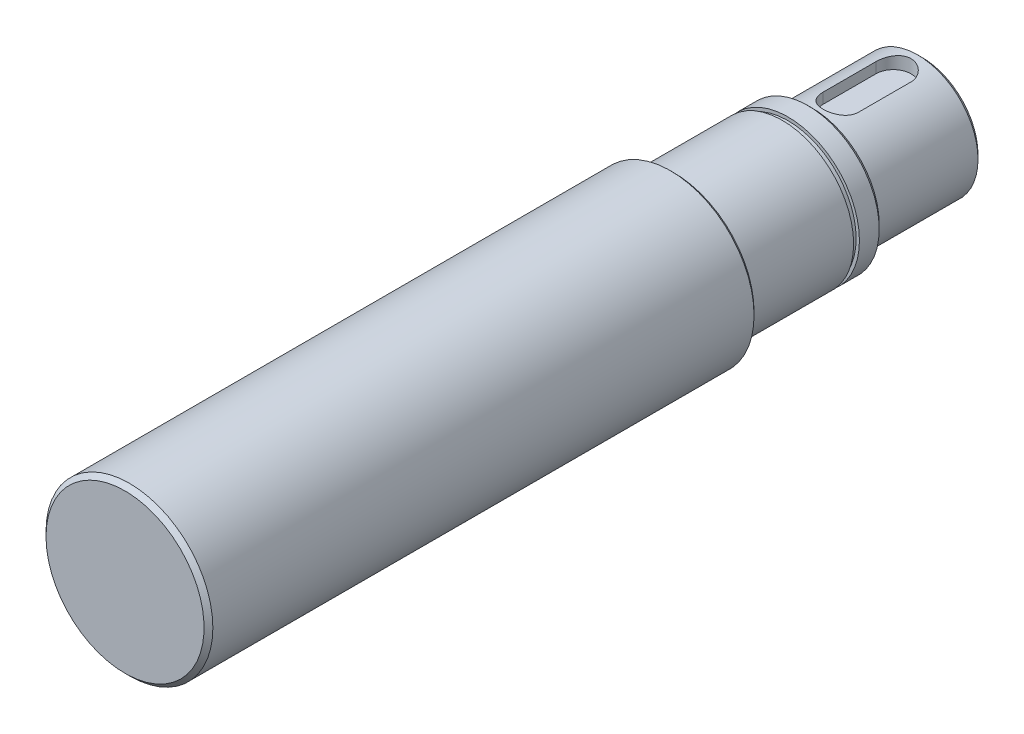
ISO-10303-21;
HEADER;
FILE_DESCRIPTION(('STEP AP214'),'2;1');
FILE_NAME('part.step','',(''),(''),'','','');
FILE_SCHEMA(('AUTOMOTIVE_DESIGN { 1 0 10303 214 1 1 1 1 }'));
ENDSEC;
DATA;
#1=APPLICATION_CONTEXT('core data for automotive mechanical design processes');
#2=APPLICATION_PROTOCOL_DEFINITION('international standard','automotive_design',2000,#1);
#3=PRODUCT_CONTEXT('',#1,'mechanical');
#4=PRODUCT('Part','Part','',(#3));
#5=PRODUCT_RELATED_PRODUCT_CATEGORY('part','',(#4));
#6=PRODUCT_DEFINITION_FORMATION('','',#4);
#7=PRODUCT_DEFINITION_CONTEXT('part definition',#1,'design');
#8=PRODUCT_DEFINITION('design','',#6,#7);
#9=PRODUCT_DEFINITION_SHAPE('','',#8);
#10=(LENGTH_UNIT() NAMED_UNIT(*) SI_UNIT(.MILLI.,.METRE.));
#11=(NAMED_UNIT(*) PLANE_ANGLE_UNIT() SI_UNIT($,.RADIAN.));
#12=(NAMED_UNIT(*) SI_UNIT($,.STERADIAN.) SOLID_ANGLE_UNIT());
#13=UNCERTAINTY_MEASURE_WITH_UNIT(LENGTH_MEASURE(1.E-05),#10,'distance_accuracy_value','');
#14=(GEOMETRIC_REPRESENTATION_CONTEXT(3) GLOBAL_UNCERTAINTY_ASSIGNED_CONTEXT((#13)) GLOBAL_UNIT_ASSIGNED_CONTEXT((#10,
#11,#12)) REPRESENTATION_CONTEXT('',''));
#15=CARTESIAN_POINT('',(0.,0.,0.));
#16=DIRECTION('',(0.,0.,1.));
#17=DIRECTION('',(1.,0.,0.));
#18=AXIS2_PLACEMENT_3D('',#15,#16,#17);
#19=CARTESIAN_POINT('',(0.,0.,0.));
#20=DIRECTION('',(0.,0.,1.));
#21=DIRECTION('',(1.,0.,0.));
#22=AXIS2_PLACEMENT_3D('',#19,#20,#21);
#23=CYLINDRICAL_SURFACE('',#22,27.5);
#24=CARTESIAN_POINT('',(0.,0.,-361.));
#25=DIRECTION('',(0.,0.,1.));
#26=DIRECTION('',(1.,0.,0.));
#27=AXIS2_PLACEMENT_3D('',#24,#25,#26);
#28=CIRCLE('',#27,27.5);
#29=CARTESIAN_POINT('',(27.5,0.,-361.));
#30=VERTEX_POINT('',#29);
#31=EDGE_CURVE('E137',#30,#30,#28,.T.);
#32=ORIENTED_EDGE('',*,*,#31,.T.);
#33=EDGE_LOOP('',(#32));
#34=FACE_BOUND('',#33,.T.);
#35=CARTESIAN_POINT('',(0.,0.,-313.));
#36=DIRECTION('',(0.,0.,1.));
#37=DIRECTION('',(1.,0.,0.));
#38=AXIS2_PLACEMENT_3D('',#35,#36,#37);
#39=CIRCLE('',#38,27.5);
#40=CARTESIAN_POINT('',(27.5,0.,-313.));
#41=VERTEX_POINT('',#40);
#42=EDGE_CURVE('E107',#41,#41,#39,.T.);
#43=ORIENTED_EDGE('',*,*,#42,.F.);
#44=EDGE_LOOP('',(#43));
#45=FACE_BOUND('',#44,.T.);
#46=CARTESIAN_POINT('',(-7.99999999999996,26.3106442338458,-326.));
#47=CARTESIAN_POINT('',(-8.0000294125095,26.3106138464806,-325.780113530022));
#48=CARTESIAN_POINT('',(-7.99093569772383,26.31339970325,-325.560238022543));
#49=CARTESIAN_POINT('',(-7.95471953682605,26.3243821575892,-325.122158396132));
#50=CARTESIAN_POINT('',(-7.92760094142261,26.3325775994905,-324.903953930281));
#51=CARTESIAN_POINT('',(-7.85563960143693,26.3541315251911,-324.471295019735));
#52=CARTESIAN_POINT('',(-7.81083993332264,26.3674774590875,-324.256832774078));
#53=CARTESIAN_POINT('',(-7.703916617101,26.3989164788629,-323.832626447351));
#54=CARTESIAN_POINT('',(-7.6417925588213,26.4170096771374,-323.622882478118));
#55=CARTESIAN_POINT('',(-7.50077525029605,26.4573947181872,-323.209657782783));
#56=CARTESIAN_POINT('',(-7.42189097222969,26.4796843137982,-323.006173772021));
#57=CARTESIAN_POINT('',(-7.24792208748815,26.5278301044113,-322.606605799624));
#58=CARTESIAN_POINT('',(-7.15283147638133,26.5536876206464,-322.410524613738));
#59=CARTESIAN_POINT('',(-6.94715180070411,26.6082392780648,-322.02703718235));
#60=CARTESIAN_POINT('',(-6.83655988627858,26.63693394056,-321.839632540443));
#61=CARTESIAN_POINT('',(-6.60065041990186,26.6963706560259,-321.47466776478));
#62=CARTESIAN_POINT('',(-6.47533210047649,26.7271128156667,-321.297108144814));
#63=CARTESIAN_POINT('',(-6.20724750295717,26.7906616850295,-320.948292516178));
#64=CARTESIAN_POINT('',(-6.06410407777572,26.8235016269389,-320.77733231253));
#65=CARTESIAN_POINT('',(-5.76409444246161,26.8895667993442,-320.44798812073));
#66=CARTESIAN_POINT('',(-5.60722801244491,26.9227920360063,-320.289604334169));
#67=CARTESIAN_POINT('',(-5.28074002072178,26.9887294799426,-319.986396684533));
#68=CARTESIAN_POINT('',(-5.11111616679033,27.0214415937379,-319.841575268861));
#69=CARTESIAN_POINT('',(-4.76020963887566,27.0854611714506,-319.566485768516));
#70=CARTESIAN_POINT('',(-4.57892729757143,27.1167686754057,-319.436217268861));
#71=CARTESIAN_POINT('',(-4.20218325463031,27.1777256203921,-319.188726974972));
#72=CARTESIAN_POINT('',(-4.006513277779,27.2073305358195,-319.071810943131));
#73=CARTESIAN_POINT('',(-3.60562548789423,27.2633528032334,-318.854975372003));
#74=CARTESIAN_POINT('',(-3.40041118318965,27.2897713138544,-318.755049649285));
#75=CARTESIAN_POINT('',(-2.98179504822856,27.3386777186889,-318.57295513461));
#76=CARTESIAN_POINT('',(-2.76839329453292,27.3611656496463,-318.490786176658));
#77=CARTESIAN_POINT('',(-2.33494709067867,27.4015581404782,-318.344916381227));
#78=CARTESIAN_POINT('',(-2.11490285367973,27.4194628472555,-318.281214951813));
#79=CARTESIAN_POINT('',(-1.67583141298464,27.4497486455739,-318.174320701728));
#80=CARTESIAN_POINT('',(-1.45693695871629,27.4622657370543,-318.130620905881));
#81=CARTESIAN_POINT('',(-1.0160336771832,27.4821099190102,-318.061646295447));
#82=CARTESIAN_POINT('',(-0.79402494340677,27.4894371649423,-318.036370928972));
#83=CARTESIAN_POINT('',(-0.348590871405693,27.4986927278334,-318.004480312374));
#84=CARTESIAN_POINT('',(-0.125165740983294,27.5006218191976,-317.997862385702));
#85=CARTESIAN_POINT('',(0.321433410377698,27.4990279887972,-318.003341440773));
#86=CARTESIAN_POINT('',(0.544607435561075,27.4955051606228,-318.015438101253));
#87=CARTESIAN_POINT('',(0.982297226132338,27.4832962687889,-318.057584554736));
#88=CARTESIAN_POINT('',(1.19687096756629,27.4747693029177,-318.087081286487));
#89=CARTESIAN_POINT('',(1.62275603314314,27.4529077240824,-318.163324954252));
#90=CARTESIAN_POINT('',(1.83406623887601,27.439571499512,-318.210077672957));
#91=CARTESIAN_POINT('',(2.25182822398422,27.4084500368961,-318.320421157209));
#92=CARTESIAN_POINT('',(2.45828159608936,27.3906662802501,-318.384006316559));
#93=CARTESIAN_POINT('',(2.86510907670471,27.351104898212,-318.527537441905));
#94=CARTESIAN_POINT('',(3.06548086879908,27.3293257727297,-318.607489554304));
#95=CARTESIAN_POINT('',(3.46091415190045,27.2820848729817,-318.784082279367));
#96=CARTESIAN_POINT('',(3.65589461195652,27.256585763757,-318.880894280446));
#97=CARTESIAN_POINT('',(4.03708759342225,27.2027387344194,-319.089920967944));
#98=CARTESIAN_POINT('',(4.22329707398693,27.1743898368239,-319.202140944188));
#99=CARTESIAN_POINT('',(4.58574078126317,27.1155802508097,-319.441180873525));
#100=CARTESIAN_POINT('',(4.76197500257396,27.0851195612476,-319.568000834522));
#101=CARTESIAN_POINT('',(5.10341760762342,27.0228653268411,-319.835411189091));
#102=CARTESIAN_POINT('',(5.2686256898903,26.9910717455921,-319.97600195892));
#103=CARTESIAN_POINT('',(5.5928388133912,26.9257959685715,-320.275438509706));
#104=CARTESIAN_POINT('',(5.75139827430262,26.892294463267,-320.434762889377));
#105=CARTESIAN_POINT('',(6.05453947809955,26.8256711887099,-320.766170771782));
#106=CARTESIAN_POINT('',(6.1991257258163,26.7925493001282,-320.938250130606));
#107=CARTESIAN_POINT('',(6.47350928570375,26.7275807630161,-321.294236271444));
#108=CARTESIAN_POINT('',(6.60329676880384,26.6957349710469,-321.478150788776));
#109=CARTESIAN_POINT('',(6.84701637082598,26.6342666832458,-321.856453868014));
#110=CARTESIAN_POINT('',(6.9609546442833,26.6046433264724,-322.050838323349));
#111=CARTESIAN_POINT('',(7.17319581827488,26.5482097665725,-322.450775500481));
#112=CARTESIAN_POINT('',(7.2713396259814,26.5214290138552,-322.656416892558));
#113=CARTESIAN_POINT('',(7.44983609545726,26.4718440062477,-323.075650004004));
#114=CARTESIAN_POINT('',(7.53019599955869,26.4490381334307,-323.28923844546));
#115=CARTESIAN_POINT('',(7.67240466982575,26.408136714196,-323.722682470673));
#116=CARTESIAN_POINT('',(7.73427282641317,26.3900362363208,-323.942531222951));
#117=CARTESIAN_POINT('',(7.83902146376052,26.3591107233259,-324.386977670108));
#118=CARTESIAN_POINT('',(7.88191072724798,26.3462832482518,-324.611573117869));
#119=CARTESIAN_POINT('',(7.94336457833754,26.3278154627766,-325.030074003083));
#120=CARTESIAN_POINT('',(7.96460439152627,26.3213881635008,-325.223556460773));
#121=CARTESIAN_POINT('',(7.9929194403277,26.312796865776,-325.611354254764));
#122=CARTESIAN_POINT('',(8.00001601625355,26.3106264443284,-325.805667892236));
#123=CARTESIAN_POINT('',(8.00000000000004,26.3106442338457,-326.));
#124=B_SPLINE_CURVE_WITH_KNOTS('',3,(#46,#47,#48,#49,#50,#51,#52,#53,#54,#55,#56,#57,#58,#59,
#60,#61,#62,#63,#64,#65,#66,#67,#68,#69,#70,#71,#72,#73,#74,#75,#76,#77,#78,#79,#80,#81,#82,#83,
#84,#85,#86,#87,#88,#89,#90,#91,#92,#93,#94,#95,#96,#97,#98,#99,#100,#101,#102,#103,#104,#105,
#106,#107,#108,#109,#110,#111,#112,#113,#114,#115,#116,#117,#118,#119,#120,#121,#122,#123),
.UNSPECIFIED.,.F.,.F.,(4,2,2,2,2,2,2,2,2,2,2,2,2,2,2,2,2,2,2,2,2,2,2,2,2,2,2,2,2,2,2,2,2,2,2,2,
2,2,4),(0.,0.659436943554304,1.31873305489974,1.97643273881427,2.63414799575148,
3.29151204385041,3.9491201763067,4.60684936645657,5.26461284971654,5.93997685054219,
6.6153516747251,7.29084813997376,7.96632533824114,8.65504200191308,9.34350747585376,
10.0319665135189,10.7204034817236,11.3902655139289,12.0601074802365,12.7298533478211,
13.3995877183439,14.0491017024097,14.6988335443704,15.3483492589521,15.9981093399169,
16.6549076019857,17.311931920769,17.968956595273,18.6259992264999,19.3069904712947,
19.9877614334312,20.668981949418,21.3499371922363,22.0373719853153,22.7245263095801,
23.4109575362287,24.0970707749295,24.6807726695567,25.2635931648056),.UNSPECIFIED.);
#125=CARTESIAN_POINT('',(-7.99999999999996,26.3106442338457,-326.));
#126=VERTEX_POINT('',#125);
#127=CARTESIAN_POINT('',(8.00000000000004,26.3106442338457,-326.));
#128=VERTEX_POINT('',#127);
#129=EDGE_CURVE('E149',#126,#128,#124,.T.);
#130=ORIENTED_EDGE('',*,*,#129,.F.);
#131=DIRECTION('',(0.,0.,1.));
#132=VECTOR('',#131,1.);
#133=CARTESIAN_POINT('',(-8.00000000000001,26.3106442338457,0.));
#134=LINE('',#133,#132);
#135=CARTESIAN_POINT('',(-7.99999999999996,26.3106442338458,-350.));
#136=VERTEX_POINT('',#135);
#137=EDGE_CURVE('E180',#126,#136,#134,.F.);
#138=ORIENTED_EDGE('',*,*,#137,.T.);
#139=CARTESIAN_POINT('',(8.00000000000005,26.3106442338457,-350.));
#140=CARTESIAN_POINT('',(8.00002941250958,26.3106138464805,-350.219886469977));
#141=CARTESIAN_POINT('',(7.99093569772392,26.31339970325,-350.439761977457));
#142=CARTESIAN_POINT('',(7.95471953682614,26.3243821575892,-350.877841603868));
#143=CARTESIAN_POINT('',(7.9276009414227,26.3325775994905,-351.096046069719));
#144=CARTESIAN_POINT('',(7.85563960143703,26.3541315251911,-351.528704980265));
#145=CARTESIAN_POINT('',(7.81083993332274,26.3674774590875,-351.743167225922));
#146=CARTESIAN_POINT('',(7.70391661710108,26.3989164788628,-352.167373552649));
#147=CARTESIAN_POINT('',(7.64179255882139,26.4170096771374,-352.377117521882));
#148=CARTESIAN_POINT('',(7.50077525029612,26.4573947181872,-352.790342217217));
#149=CARTESIAN_POINT('',(7.42189097222975,26.4796843137982,-352.993826227979));
#150=CARTESIAN_POINT('',(7.2479220874882,26.5278301044113,-353.393394200376));
#151=CARTESIAN_POINT('',(7.15283147638138,26.5536876206464,-353.589475386262));
#152=CARTESIAN_POINT('',(6.94715180070418,26.6082392780648,-353.97296281765));
#153=CARTESIAN_POINT('',(6.83655988627866,26.63693394056,-354.160367459557));
#154=CARTESIAN_POINT('',(6.60065041990195,26.6963706560259,-354.525332235219));
#155=CARTESIAN_POINT('',(6.47533210047658,26.7271128156666,-354.702891855186));
#156=CARTESIAN_POINT('',(6.20724750295725,26.7906616850295,-355.051707483822));
#157=CARTESIAN_POINT('',(6.06410407777579,26.8235016269389,-355.22266768747));
#158=CARTESIAN_POINT('',(5.76409444246166,26.8895667993442,-355.55201187927));
#159=CARTESIAN_POINT('',(5.60722801244494,26.9227920360062,-355.710395665831));
#160=CARTESIAN_POINT('',(5.28074002072182,26.9887294799426,-356.013603315467));
#161=CARTESIAN_POINT('',(5.11111616679037,27.0214415937379,-356.158424731139));
#162=CARTESIAN_POINT('',(4.76020963887572,27.0854611714506,-356.433514231484));
#163=CARTESIAN_POINT('',(4.57892729757151,27.1167686754057,-356.563782731139));
#164=CARTESIAN_POINT('',(4.2021832546304,27.1777256203921,-356.811273025028));
#165=CARTESIAN_POINT('',(4.0065132777791,27.2073305358195,-356.928189056869));
#166=CARTESIAN_POINT('',(3.60562548789433,27.2633528032334,-357.145024627996));
#167=CARTESIAN_POINT('',(3.40041118318975,27.2897713138544,-357.244950350715));
#168=CARTESIAN_POINT('',(2.98179504822865,27.3386777186889,-357.42704486539));
#169=CARTESIAN_POINT('',(2.76839329453301,27.3611656496463,-357.509213823342));
#170=CARTESIAN_POINT('',(2.33494709067876,27.4015581404782,-357.655083618773));
#171=CARTESIAN_POINT('',(2.11490285367981,27.4194628472555,-357.718785048187));
#172=CARTESIAN_POINT('',(1.67583141298473,27.4497486455739,-357.825679298272));
#173=CARTESIAN_POINT('',(1.45693695871638,27.4622657370543,-357.869379094119));
#174=CARTESIAN_POINT('',(1.01603367718329,27.4821099190102,-357.938353704553));
#175=CARTESIAN_POINT('',(0.794024943406861,27.4894371649423,-357.963629071028));
#176=CARTESIAN_POINT('',(0.348590871405785,27.4986927278334,-357.995519687626));
#177=CARTESIAN_POINT('',(0.125165740983385,27.5006218191976,-358.002137614298));
#178=CARTESIAN_POINT('',(-0.321433410377609,27.4990279887972,-357.996658559227));
#179=CARTESIAN_POINT('',(-0.544607435560986,27.4955051606229,-357.984561898747));
#180=CARTESIAN_POINT('',(-0.982297226132247,27.4832962687889,-357.942415445264));
#181=CARTESIAN_POINT('',(-1.19687096756619,27.4747693029177,-357.912918713513));
#182=CARTESIAN_POINT('',(-1.62275603314305,27.4529077240824,-357.836675045748));
#183=CARTESIAN_POINT('',(-1.83406623887592,27.439571499512,-357.789922327043));
#184=CARTESIAN_POINT('',(-2.25182822398413,27.4084500368961,-357.679578842791));
#185=CARTESIAN_POINT('',(-2.45828159608927,27.3906662802501,-357.615993683441));
#186=CARTESIAN_POINT('',(-2.86510907670462,27.351104898212,-357.472462558095));
#187=CARTESIAN_POINT('',(-3.06548086879899,27.3293257727297,-357.392510445696));
#188=CARTESIAN_POINT('',(-3.46091415190036,27.2820848729818,-357.215917720633));
#189=CARTESIAN_POINT('',(-3.65589461195644,27.2565857637571,-357.119105719554));
#190=CARTESIAN_POINT('',(-4.03708759342216,27.2027387344195,-356.910079032056));
#191=CARTESIAN_POINT('',(-4.22329707398684,27.1743898368239,-356.797859055812));
#192=CARTESIAN_POINT('',(-4.58574078126309,27.1155802508097,-356.558819126475));
#193=CARTESIAN_POINT('',(-4.7619750025739,27.0851195612476,-356.431999165478));
#194=CARTESIAN_POINT('',(-5.10341760762335,27.0228653268412,-356.164588810909));
#195=CARTESIAN_POINT('',(-5.26862568989023,26.9910717455921,-356.02399804108));
#196=CARTESIAN_POINT('',(-5.59283881339109,26.9257959685715,-355.724561490294));
#197=CARTESIAN_POINT('',(-5.75139827430251,26.892294463267,-355.565237110623));
#198=CARTESIAN_POINT('',(-6.05453947809944,26.8256711887099,-355.233829228218));
#199=CARTESIAN_POINT('',(-6.19912572581619,26.7925493001282,-355.061749869394));
#200=CARTESIAN_POINT('',(-6.47350928570364,26.7275807630162,-354.705763728556));
#201=CARTESIAN_POINT('',(-6.60329676880374,26.6957349710469,-354.521849211224));
#202=CARTESIAN_POINT('',(-6.84701637082589,26.6342666832458,-354.143546131985));
#203=CARTESIAN_POINT('',(-6.96095464428321,26.6046433264724,-353.949161676651));
#204=CARTESIAN_POINT('',(-7.17319581827479,26.5482097665725,-353.549224499519));
#205=CARTESIAN_POINT('',(-7.27133962598131,26.5214290138552,-353.343583107442));
#206=CARTESIAN_POINT('',(-7.44983609545716,26.4718440062477,-352.924349995996));
#207=CARTESIAN_POINT('',(-7.53019599955859,26.4490381334307,-352.71076155454));
#208=CARTESIAN_POINT('',(-7.67240466982565,26.408136714196,-352.277317529327));
#209=CARTESIAN_POINT('',(-7.73427282641306,26.3900362363208,-352.057468777049));
#210=CARTESIAN_POINT('',(-7.83902146376042,26.3591107233259,-351.613022329892));
#211=CARTESIAN_POINT('',(-7.88191072724789,26.3462832482518,-351.388426882132));
#212=CARTESIAN_POINT('',(-7.94336457833745,26.3278154627767,-350.969925996917));
#213=CARTESIAN_POINT('',(-7.96460439152619,26.3213881635008,-350.776443539227));
#214=CARTESIAN_POINT('',(-7.99291944032762,26.312796865776,-350.388645745236));
#215=CARTESIAN_POINT('',(-8.00001601625346,26.3106264443285,-350.194332107764));
#216=CARTESIAN_POINT('',(-7.99999999999996,26.3106442338458,-350.));
#217=B_SPLINE_CURVE_WITH_KNOTS('',3,(#139,#140,#141,#142,#143,#144,#145,#146,#147,#148,#149,
#150,#151,#152,#153,#154,#155,#156,#157,#158,#159,#160,#161,#162,#163,#164,#165,#166,#167,#168,
#169,#170,#171,#172,#173,#174,#175,#176,#177,#178,#179,#180,#181,#182,#183,#184,#185,#186,#187,
#188,#189,#190,#191,#192,#193,#194,#195,#196,#197,#198,#199,#200,#201,#202,#203,#204,#205,#206,
#207,#208,#209,#210,#211,#212,#213,#214,#215,#216),.UNSPECIFIED.,.F.,.F.,(4,2,2,2,2,2,2,2,2,2,2,
2,2,2,2,2,2,2,2,2,2,2,2,2,2,2,2,2,2,2,2,2,2,2,2,2,2,2,4),(0.,0.659436943554193,1.31873305489968,
1.97643273881427,2.63414799575148,3.29151204385053,3.94912017630677,4.60684936645652,
5.26461284971654,5.93997685054225,6.61535167472518,7.29084813997383,7.96632533824115,
8.65504200191304,9.34350747585376,10.0319665135189,10.7204034817236,11.3902655139289,
12.0601074802365,12.7298533478211,13.3995877183439,14.0491017024097,14.6988335443704,
15.3483492589521,15.9981093399169,16.6549076019857,17.311931920769,17.968956595273,
18.6259992264999,19.3069904712947,19.9877614334311,20.668981949418,21.3499371922364,
22.0373719853153,22.7245263095801,23.4109575362286,24.0970707749295,24.6807726695567,
25.2635931648056),.UNSPECIFIED.);
#218=CARTESIAN_POINT('',(8.00000000000005,26.3106442338457,-350.));
#219=VERTEX_POINT('',#218);
#220=EDGE_CURVE('E68',#219,#136,#217,.T.);
#221=ORIENTED_EDGE('',*,*,#220,.F.);
#222=DIRECTION('',(0.,0.,1.));
#223=VECTOR('',#222,1.);
#224=CARTESIAN_POINT('',(8.00000000000002,26.3106442338457,0.));
#225=LINE('',#224,#223);
#226=EDGE_CURVE('E106',#128,#219,#225,.F.);
#227=ORIENTED_EDGE('',*,*,#226,.F.);
#228=EDGE_LOOP('',(#130,#138,#221,#227));
#229=FACE_BOUND('',#228,.T.);
#230=ADVANCED_FACE('F45',(#34,#45,#229),#23,.T.);
#231=CARTESIAN_POINT('',(0.,0.,0.));
#232=DIRECTION('',(0.,0.,-1.));
#233=DIRECTION('',(-1.,0.,0.));
#234=AXIS2_PLACEMENT_3D('',#231,#232,#233);
#235=PLANE('',#234);
#236=CARTESIAN_POINT('',(0.,0.,0.));
#237=DIRECTION('',(0.,0.,-1.));
#238=DIRECTION('',(-1.,0.,0.));
#239=AXIS2_PLACEMENT_3D('',#236,#237,#238);
#240=CIRCLE('',#239,36.);
#241=CARTESIAN_POINT('',(-36.,0.,0.));
#242=VERTEX_POINT('',#241);
#243=EDGE_CURVE('E131',#242,#242,#240,.F.);
#244=ORIENTED_EDGE('',*,*,#243,.T.);
#245=EDGE_LOOP('',(#244));
#246=FACE_BOUND('',#245,.T.);
#247=ADVANCED_FACE('F195',(#246),#235,.F.);
#248=CARTESIAN_POINT('',(0.,0.,0.));
#249=DIRECTION('',(0.,0.,1.));
#250=DIRECTION('',(1.,0.,0.));
#251=AXIS2_PLACEMENT_3D('',#248,#249,#250);
#252=CYLINDRICAL_SURFACE('',#251,38.);
#253=CARTESIAN_POINT('',(0.,0.,-248.5));
#254=DIRECTION('',(0.,0.,1.));
#255=DIRECTION('',(1.,0.,0.));
#256=AXIS2_PLACEMENT_3D('',#253,#254,#255);
#257=CIRCLE('',#256,38.);
#258=CARTESIAN_POINT('',(38.,0.,-248.5));
#259=VERTEX_POINT('',#258);
#260=EDGE_CURVE('E143',#259,#259,#257,.T.);
#261=ORIENTED_EDGE('',*,*,#260,.T.);
#262=EDGE_LOOP('',(#261));
#263=FACE_BOUND('',#262,.T.);
#264=CARTESIAN_POINT('',(0.,0.,-2.00000000000004));
#265=DIRECTION('',(0.,0.,-1.));
#266=DIRECTION('',(-1.,0.,0.));
#267=AXIS2_PLACEMENT_3D('',#264,#265,#266);
#268=CIRCLE('',#267,38.);
#269=CARTESIAN_POINT('',(-38.,0.,-2.00000000000004));
#270=VERTEX_POINT('',#269);
#271=EDGE_CURVE('E134',#270,#270,#268,.T.);
#272=ORIENTED_EDGE('',*,*,#271,.T.);
#273=EDGE_LOOP('',(#272));
#274=FACE_BOUND('',#273,.T.);
#275=ADVANCED_FACE('F201',(#263,#274),#252,.T.);
#276=CARTESIAN_POINT('',(0.,38.,-250.));
#277=DIRECTION('',(0.,0.,1.));
#278=DIRECTION('',(1.,0.,0.));
#279=AXIS2_PLACEMENT_3D('',#276,#277,#278);
#280=PLANE('',#279);
#281=CARTESIAN_POINT('',(0.,0.,-250.));
#282=DIRECTION('',(0.,0.,1.));
#283=DIRECTION('',(1.,0.,0.));
#284=AXIS2_PLACEMENT_3D('',#281,#282,#283);
#285=CIRCLE('',#284,36.5);
#286=CARTESIAN_POINT('',(36.5,0.,-250.));
#287=VERTEX_POINT('',#286);
#288=EDGE_CURVE('E146',#287,#287,#285,.F.);
#289=ORIENTED_EDGE('',*,*,#288,.T.);
#290=EDGE_LOOP('',(#289));
#291=FACE_BOUND('',#290,.T.);
#292=CARTESIAN_POINT('',(0.,0.,-250.));
#293=DIRECTION('',(0.,0.,1.));
#294=DIRECTION('',(1.,0.,0.));
#295=AXIS2_PLACEMENT_3D('',#292,#293,#294);
#296=CIRCLE('',#295,32.5);
#297=CARTESIAN_POINT('',(32.5,0.,-250.));
#298=VERTEX_POINT('',#297);
#299=EDGE_CURVE('E128',#298,#298,#296,.T.);
#300=ORIENTED_EDGE('',*,*,#299,.T.);
#301=EDGE_LOOP('',(#300));
#302=FACE_BOUND('',#301,.T.);
#303=ADVANCED_FACE('F306',(#291,#302),#280,.F.);
#304=CARTESIAN_POINT('',(0.,0.,0.));
#305=DIRECTION('',(0.,0.,1.));
#306=DIRECTION('',(1.,0.,0.));
#307=AXIS2_PLACEMENT_3D('',#304,#305,#306);
#308=CYLINDRICAL_SURFACE('',#307,32.5);
#309=ORIENTED_EDGE('',*,*,#299,.F.);
#310=EDGE_LOOP('',(#309));
#311=FACE_BOUND('',#310,.T.);
#312=CARTESIAN_POINT('',(0.,0.,-299.35));
#313=DIRECTION('',(0.,0.,1.));
#314=DIRECTION('',(1.,0.,0.));
#315=AXIS2_PLACEMENT_3D('',#312,#313,#314);
#316=CIRCLE('',#315,32.5);
#317=CARTESIAN_POINT('',(32.5,0.,-299.35));
#318=VERTEX_POINT('',#317);
#319=EDGE_CURVE('E125',#318,#318,#316,.T.);
#320=ORIENTED_EDGE('',*,*,#319,.T.);
#321=EDGE_LOOP('',(#320));
#322=FACE_BOUND('',#321,.T.);
#323=ADVANCED_FACE('F309',(#311,#322),#308,.T.);
#324=CARTESIAN_POINT('',(0.,32.5,-299.35));
#325=DIRECTION('',(0.,0.,1.));
#326=DIRECTION('',(1.,0.,0.));
#327=AXIS2_PLACEMENT_3D('',#324,#325,#326);
#328=PLANE('',#327);
#329=ORIENTED_EDGE('',*,*,#319,.F.);
#330=EDGE_LOOP('',(#329));
#331=FACE_BOUND('',#330,.T.);
#332=CARTESIAN_POINT('',(0.,0.,-299.35));
#333=DIRECTION('',(0.,0.,1.));
#334=DIRECTION('',(1.,0.,0.));
#335=AXIS2_PLACEMENT_3D('',#332,#333,#334);
#336=CIRCLE('',#335,31.);
#337=CARTESIAN_POINT('',(31.,0.,-299.35));
#338=VERTEX_POINT('',#337);
#339=EDGE_CURVE('E122',#338,#338,#336,.T.);
#340=ORIENTED_EDGE('',*,*,#339,.T.);
#341=EDGE_LOOP('',(#340));
#342=FACE_BOUND('',#341,.T.);
#343=ADVANCED_FACE('F342',(#331,#342),#328,.F.);
#344=CARTESIAN_POINT('',(0.,0.,0.));
#345=DIRECTION('',(0.,0.,1.));
#346=DIRECTION('',(1.,0.,0.));
#347=AXIS2_PLACEMENT_3D('',#344,#345,#346);
#348=CYLINDRICAL_SURFACE('',#347,31.);
#349=ORIENTED_EDGE('',*,*,#339,.F.);
#350=EDGE_LOOP('',(#349));
#351=FACE_BOUND('',#350,.T.);
#352=CARTESIAN_POINT('',(0.,0.,-302.));
#353=DIRECTION('',(0.,0.,1.));
#354=DIRECTION('',(1.,0.,0.));
#355=AXIS2_PLACEMENT_3D('',#352,#353,#354);
#356=CIRCLE('',#355,31.);
#357=CARTESIAN_POINT('',(31.,0.,-302.));
#358=VERTEX_POINT('',#357);
#359=EDGE_CURVE('E119',#358,#358,#356,.T.);
#360=ORIENTED_EDGE('',*,*,#359,.T.);
#361=EDGE_LOOP('',(#360));
#362=FACE_BOUND('',#361,.T.);
#363=ADVANCED_FACE('F333',(#351,#362),#348,.T.);
#364=CARTESIAN_POINT('',(0.,31.,-302.));
#365=DIRECTION('',(0.,0.,-1.));
#366=DIRECTION('',(-1.,0.,0.));
#367=AXIS2_PLACEMENT_3D('',#364,#365,#366);
#368=PLANE('',#367);
#369=ORIENTED_EDGE('',*,*,#359,.F.);
#370=EDGE_LOOP('',(#369));
#371=FACE_BOUND('',#370,.T.);
#372=CARTESIAN_POINT('',(0.,0.,-302.));
#373=DIRECTION('',(0.,0.,1.));
#374=DIRECTION('',(1.,0.,0.));
#375=AXIS2_PLACEMENT_3D('',#372,#373,#374);
#376=CIRCLE('',#375,32.5);
#377=CARTESIAN_POINT('',(32.5,0.,-302.));
#378=VERTEX_POINT('',#377);
#379=EDGE_CURVE('E111',#378,#378,#376,.T.);
#380=ORIENTED_EDGE('',*,*,#379,.T.);
#381=EDGE_LOOP('',(#380));
#382=FACE_BOUND('',#381,.T.);
#383=ADVANCED_FACE('F230',(#371,#382),#368,.F.);
#384=CARTESIAN_POINT('',(0.,0.,0.));
#385=DIRECTION('',(0.,0.,1.));
#386=DIRECTION('',(1.,0.,0.));
#387=AXIS2_PLACEMENT_3D('',#384,#385,#386);
#388=CYLINDRICAL_SURFACE('',#387,32.5);
#389=CARTESIAN_POINT('',(0.,0.,-311.));
#390=DIRECTION('',(0.,0.,1.));
#391=DIRECTION('',(1.,0.,0.));
#392=AXIS2_PLACEMENT_3D('',#389,#390,#391);
#393=CIRCLE('',#392,32.5);
#394=CARTESIAN_POINT('',(32.5,0.,-311.));
#395=VERTEX_POINT('',#394);
#396=EDGE_CURVE('E54',#395,#395,#393,.T.);
#397=ORIENTED_EDGE('',*,*,#396,.T.);
#398=EDGE_LOOP('',(#397));
#399=FACE_BOUND('',#398,.T.);
#400=ORIENTED_EDGE('',*,*,#379,.F.);
#401=EDGE_LOOP('',(#400));
#402=FACE_BOUND('',#401,.T.);
#403=ADVANCED_FACE('F184',(#399,#402),#388,.T.);
#404=CARTESIAN_POINT('',(0.,32.5,-313.));
#405=DIRECTION('',(0.,0.,1.));
#406=DIRECTION('',(1.,0.,0.));
#407=AXIS2_PLACEMENT_3D('',#404,#405,#406);
#408=PLANE('',#407);
#409=CARTESIAN_POINT('',(0.,0.,-313.));
#410=DIRECTION('',(0.,0.,1.));
#411=DIRECTION('',(1.,0.,0.));
#412=AXIS2_PLACEMENT_3D('',#409,#410,#411);
#413=CIRCLE('',#412,30.5);
#414=CARTESIAN_POINT('',(30.5,0.,-313.));
#415=VERTEX_POINT('',#414);
#416=EDGE_CURVE('E11',#415,#415,#413,.F.);
#417=ORIENTED_EDGE('',*,*,#416,.T.);
#418=EDGE_LOOP('',(#417));
#419=FACE_BOUND('',#418,.T.);
#420=ORIENTED_EDGE('',*,*,#42,.T.);
#421=EDGE_LOOP('',(#420));
#422=FACE_BOUND('',#421,.T.);
#423=ADVANCED_FACE('F229',(#419,#422),#408,.F.);
#424=CARTESIAN_POINT('',(0.,27.5,-363.));
#425=DIRECTION('',(0.,0.,1.));
#426=DIRECTION('',(1.,0.,0.));
#427=AXIS2_PLACEMENT_3D('',#424,#425,#426);
#428=PLANE('',#427);
#429=CARTESIAN_POINT('',(0.,0.,-363.));
#430=DIRECTION('',(0.,0.,1.));
#431=DIRECTION('',(1.,0.,0.));
#432=AXIS2_PLACEMENT_3D('',#429,#430,#431);
#433=CIRCLE('',#432,25.4999999999999);
#434=CARTESIAN_POINT('',(25.4999999999999,0.,-363.));
#435=VERTEX_POINT('',#434);
#436=EDGE_CURVE('E140',#435,#435,#433,.F.);
#437=ORIENTED_EDGE('',*,*,#436,.T.);
#438=EDGE_LOOP('',(#437));
#439=FACE_BOUND('',#438,.T.);
#440=ADVANCED_FACE('F174',(#439),#428,.F.);
#441=CARTESIAN_POINT('',(0.,0.,0.));
#442=DIRECTION('',(0.,0.,-1.));
#443=DIRECTION('',(-1.,0.,0.));
#444=AXIS2_PLACEMENT_3D('',#441,#442,#443);
#445=CONICAL_SURFACE('',#444,36.,0.785398163397443);
#446=ORIENTED_EDGE('',*,*,#271,.F.);
#447=EDGE_LOOP('',(#446));
#448=FACE_BOUND('',#447,.T.);
#449=ORIENTED_EDGE('',*,*,#243,.F.);
#450=EDGE_LOOP('',(#449));
#451=FACE_BOUND('',#450,.T.);
#452=ADVANCED_FACE('F249',(#448,#451),#445,.T.);
#453=CARTESIAN_POINT('',(0.,0.,-361.));
#454=DIRECTION('',(0.,0.,1.));
#455=DIRECTION('',(1.,0.,0.));
#456=AXIS2_PLACEMENT_3D('',#453,#454,#455);
#457=CONICAL_SURFACE('',#456,27.5,0.785398163397464);
#458=ORIENTED_EDGE('',*,*,#436,.F.);
#459=EDGE_LOOP('',(#458));
#460=FACE_BOUND('',#459,.T.);
#461=ORIENTED_EDGE('',*,*,#31,.F.);
#462=EDGE_LOOP('',(#461));
#463=FACE_BOUND('',#462,.T.);
#464=ADVANCED_FACE('F258',(#460,#463),#457,.T.);
#465=CARTESIAN_POINT('',(0.,0.,-248.5));
#466=DIRECTION('',(0.,0.,1.));
#467=DIRECTION('',(1.,0.,0.));
#468=AXIS2_PLACEMENT_3D('',#465,#466,#467);
#469=CONICAL_SURFACE('',#468,38.,0.785398163397437);
#470=ORIENTED_EDGE('',*,*,#288,.F.);
#471=EDGE_LOOP('',(#470));
#472=FACE_BOUND('',#471,.T.);
#473=ORIENTED_EDGE('',*,*,#260,.F.);
#474=EDGE_LOOP('',(#473));
#475=FACE_BOUND('',#474,.T.);
#476=ADVANCED_FACE('F173',(#472,#475),#469,.T.);
#477=CARTESIAN_POINT('',(0.,21.5,-350.));
#478=DIRECTION('',(0.,1.,0.));
#479=DIRECTION('',(0.,0.,1.));
#480=AXIS2_PLACEMENT_3D('',#477,#478,#479);
#481=CYLINDRICAL_SURFACE('',#480,8.);
#482=DIRECTION('',(0.,1.,0.));
#483=VECTOR('',#482,1.);
#484=CARTESIAN_POINT('',(8.00000000000005,21.5,-350.));
#485=LINE('',#484,#483);
#486=CARTESIAN_POINT('',(8.00000000000005,21.5,-350.));
#487=VERTEX_POINT('',#486);
#488=EDGE_CURVE('E103',#487,#219,#485,.T.);
#489=ORIENTED_EDGE('',*,*,#488,.T.);
#490=ORIENTED_EDGE('',*,*,#220,.T.);
#491=DIRECTION('',(0.,1.,0.));
#492=VECTOR('',#491,1.);
#493=CARTESIAN_POINT('',(-7.99999999999996,21.5,-350.));
#494=LINE('',#493,#492);
#495=CARTESIAN_POINT('',(-7.99999999999996,21.5,-350.));
#496=VERTEX_POINT('',#495);
#497=EDGE_CURVE('E61',#496,#136,#494,.T.);
#498=ORIENTED_EDGE('',*,*,#497,.F.);
#499=CARTESIAN_POINT('',(0.,21.5,-350.));
#500=DIRECTION('',(0.,-1.,0.));
#501=DIRECTION('',(0.,0.,-1.));
#502=AXIS2_PLACEMENT_3D('',#499,#500,#501);
#503=CIRCLE('',#502,8.);
#504=EDGE_CURVE('E93',#496,#487,#503,.T.);
#505=ORIENTED_EDGE('',*,*,#504,.T.);
#506=EDGE_LOOP('',(#489,#490,#498,#505));
#507=FACE_BOUND('',#506,.T.);
#508=ADVANCED_FACE('F102',(#507),#481,.F.);
#509=CARTESIAN_POINT('',(8.00000000000005,21.5,-350.));
#510=DIRECTION('',(-1.,0.,0.));
#511=DIRECTION('',(0.,0.,1.));
#512=AXIS2_PLACEMENT_3D('',#509,#510,#511);
#513=PLANE('',#512);
#514=ORIENTED_EDGE('',*,*,#226,.T.);
#515=ORIENTED_EDGE('',*,*,#488,.F.);
#516=DIRECTION('',(0.,0.,1.));
#517=VECTOR('',#516,1.);
#518=CARTESIAN_POINT('',(8.00000000000005,21.5,-350.));
#519=LINE('',#518,#517);
#520=CARTESIAN_POINT('',(8.00000000000004,21.5,-326.));
#521=VERTEX_POINT('',#520);
#522=EDGE_CURVE('E89',#487,#521,#519,.T.);
#523=ORIENTED_EDGE('',*,*,#522,.T.);
#524=DIRECTION('',(0.,1.,0.));
#525=VECTOR('',#524,1.);
#526=CARTESIAN_POINT('',(8.00000000000004,21.5,-326.));
#527=LINE('',#526,#525);
#528=EDGE_CURVE('E108',#521,#128,#527,.T.);
#529=ORIENTED_EDGE('',*,*,#528,.T.);
#530=EDGE_LOOP('',(#514,#515,#523,#529));
#531=FACE_BOUND('',#530,.T.);
#532=ADVANCED_FACE('F105',(#531),#513,.T.);
#533=CARTESIAN_POINT('',(0.,21.5,-326.));
#534=DIRECTION('',(0.,1.,0.));
#535=DIRECTION('',(0.,0.,1.));
#536=AXIS2_PLACEMENT_3D('',#533,#534,#535);
#537=CYLINDRICAL_SURFACE('',#536,8.);
#538=DIRECTION('',(0.,1.,0.));
#539=VECTOR('',#538,1.);
#540=CARTESIAN_POINT('',(-7.99999999999996,21.5,-326.));
#541=LINE('',#540,#539);
#542=CARTESIAN_POINT('',(-7.99999999999996,21.5,-326.));
#543=VERTEX_POINT('',#542);
#544=EDGE_CURVE('E113',#543,#126,#541,.T.);
#545=ORIENTED_EDGE('',*,*,#544,.T.);
#546=ORIENTED_EDGE('',*,*,#129,.T.);
#547=ORIENTED_EDGE('',*,*,#528,.F.);
#548=CARTESIAN_POINT('',(0.,21.5,-326.));
#549=DIRECTION('',(0.,-1.,0.));
#550=DIRECTION('',(0.,0.,-1.));
#551=AXIS2_PLACEMENT_3D('',#548,#549,#550);
#552=CIRCLE('',#551,8.);
#553=EDGE_CURVE('E94',#521,#543,#552,.T.);
#554=ORIENTED_EDGE('',*,*,#553,.T.);
#555=EDGE_LOOP('',(#545,#546,#547,#554));
#556=FACE_BOUND('',#555,.T.);
#557=ADVANCED_FACE('F161',(#556),#537,.F.);
#558=CARTESIAN_POINT('',(-7.99999999999996,21.5,-350.));
#559=DIRECTION('',(-1.,0.,0.));
#560=DIRECTION('',(0.,0.,1.));
#561=AXIS2_PLACEMENT_3D('',#558,#559,#560);
#562=PLANE('',#561);
#563=ORIENTED_EDGE('',*,*,#544,.F.);
#564=DIRECTION('',(0.,0.,1.));
#565=VECTOR('',#564,1.);
#566=CARTESIAN_POINT('',(-7.99999999999996,21.5,-350.));
#567=LINE('',#566,#565);
#568=EDGE_CURVE('E209',#496,#543,#567,.T.);
#569=ORIENTED_EDGE('',*,*,#568,.F.);
#570=ORIENTED_EDGE('',*,*,#497,.T.);
#571=ORIENTED_EDGE('',*,*,#137,.F.);
#572=EDGE_LOOP('',(#563,#569,#570,#571));
#573=FACE_BOUND('',#572,.T.);
#574=ADVANCED_FACE('F166',(#573),#562,.F.);
#575=CARTESIAN_POINT('',(0.,21.5,-350.));
#576=DIRECTION('',(0.,-1.,0.));
#577=DIRECTION('',(0.,0.,-1.));
#578=AXIS2_PLACEMENT_3D('',#575,#576,#577);
#579=PLANE('',#578);
#580=ORIENTED_EDGE('',*,*,#504,.F.);
#581=ORIENTED_EDGE('',*,*,#568,.T.);
#582=ORIENTED_EDGE('',*,*,#553,.F.);
#583=ORIENTED_EDGE('',*,*,#522,.F.);
#584=EDGE_LOOP('',(#580,#581,#582,#583));
#585=FACE_BOUND('',#584,.T.);
#586=ADVANCED_FACE('F91',(#585),#579,.F.);
#587=CARTESIAN_POINT('',(0.,0.,-311.));
#588=DIRECTION('',(0.,0.,1.));
#589=DIRECTION('',(1.,0.,0.));
#590=AXIS2_PLACEMENT_3D('',#587,#588,#589);
#591=CONICAL_SURFACE('',#590,32.5,0.785398163397454);
#592=ORIENTED_EDGE('',*,*,#416,.F.);
#593=EDGE_LOOP('',(#592));
#594=FACE_BOUND('',#593,.T.);
#595=ORIENTED_EDGE('',*,*,#396,.F.);
#596=EDGE_LOOP('',(#595));
#597=FACE_BOUND('',#596,.T.);
#598=ADVANCED_FACE('F48',(#594,#597),#591,.T.);
#599=CLOSED_SHELL('',(#230,#247,#275,#303,#323,#343,#363,#383,#403,#423,#440,#452,#464,#476,
#508,#532,#557,#574,#586,#598));
#600=MANIFOLD_SOLID_BREP('B2',#599);
#601=ADVANCED_BREP_SHAPE_REPRESENTATION('',(#18,#600),#14);
#602=SHAPE_DEFINITION_REPRESENTATION(#9,#601);
ENDSEC;
END-ISO-10303-21;
